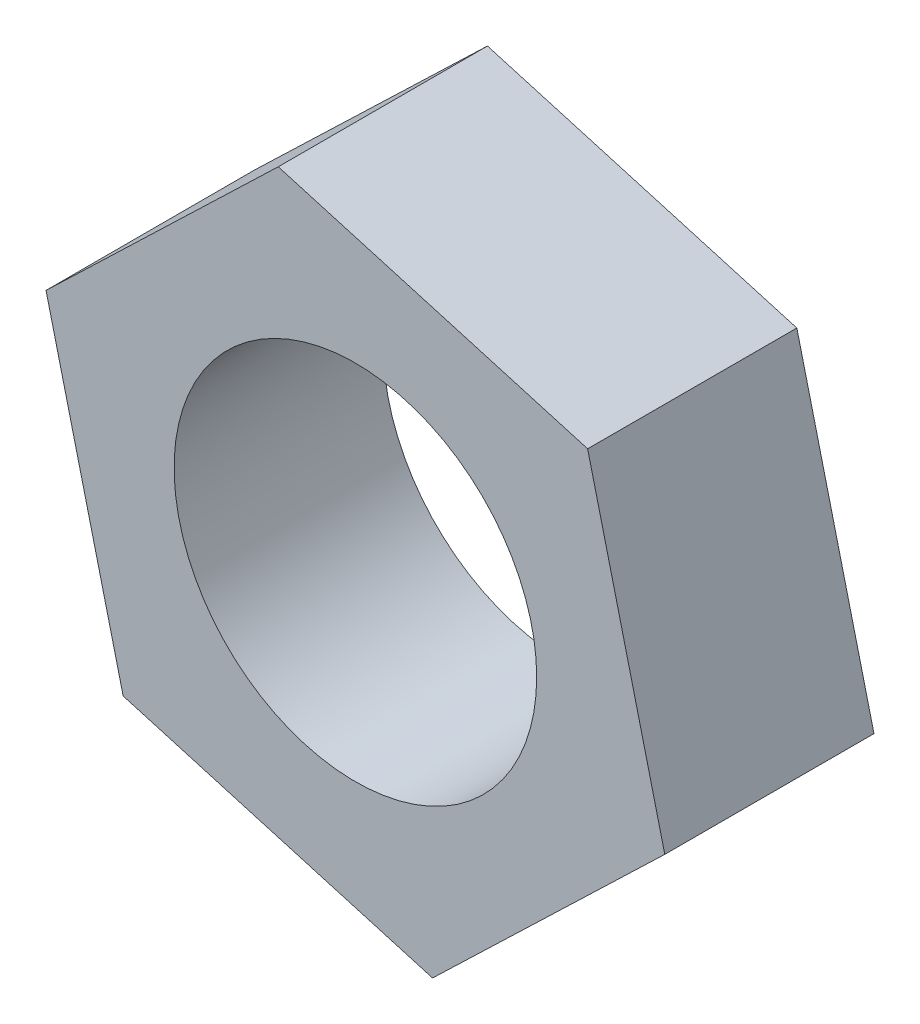
ISO-10303-21;
HEADER;
FILE_DESCRIPTION(('STEP AP214'),'2;1');
FILE_NAME('part.step','',(''),(''),'','','');
FILE_SCHEMA(('AUTOMOTIVE_DESIGN { 1 0 10303 214 1 1 1 1 }'));
ENDSEC;
DATA;
#1=APPLICATION_CONTEXT('core data for automotive mechanical design processes');
#2=APPLICATION_PROTOCOL_DEFINITION('international standard','automotive_design',2000,#1);
#3=PRODUCT_CONTEXT('',#1,'mechanical');
#4=PRODUCT('Part','Part','',(#3));
#5=PRODUCT_RELATED_PRODUCT_CATEGORY('part','',(#4));
#6=PRODUCT_DEFINITION_FORMATION('','',#4);
#7=PRODUCT_DEFINITION_CONTEXT('part definition',#1,'design');
#8=PRODUCT_DEFINITION('design','',#6,#7);
#9=PRODUCT_DEFINITION_SHAPE('','',#8);
#10=(LENGTH_UNIT() NAMED_UNIT(*) SI_UNIT(.MILLI.,.METRE.));
#11=(NAMED_UNIT(*) PLANE_ANGLE_UNIT() SI_UNIT($,.RADIAN.));
#12=(NAMED_UNIT(*) SI_UNIT($,.STERADIAN.) SOLID_ANGLE_UNIT());
#13=UNCERTAINTY_MEASURE_WITH_UNIT(LENGTH_MEASURE(1.E-05),#10,'distance_accuracy_value','');
#14=(GEOMETRIC_REPRESENTATION_CONTEXT(3) GLOBAL_UNCERTAINTY_ASSIGNED_CONTEXT((#13)) GLOBAL_UNIT_ASSIGNED_CONTEXT((#10,
#11,#12)) REPRESENTATION_CONTEXT('',''));
#15=CARTESIAN_POINT('',(0.,0.,0.));
#16=DIRECTION('',(0.,0.,1.));
#17=DIRECTION('',(1.,0.,0.));
#18=AXIS2_PLACEMENT_3D('',#15,#16,#17);
#19=CARTESIAN_POINT('',(0.,0.,3.));
#20=DIRECTION('',(0.,0.,1.));
#21=DIRECTION('',(1.,0.,0.));
#22=AXIS2_PLACEMENT_3D('',#19,#20,#21);
#23=PLANE('',#22);
#24=DIRECTION('',(0.960574467566199,-0.278022826868429,0.));
#25=VECTOR('',#24,1.);
#26=CARTESIAN_POINT('',(-3.33044301717783,-3.20023165453141,3.));
#27=LINE('',#26,#25);
#28=CARTESIAN_POINT('',(-3.33044301717783,-3.20023165453141,3.));
#29=VERTEX_POINT('',#28);
#30=CARTESIAN_POINT('',(1.10626040223039,-4.48436408599819,3.));
#31=VERTEX_POINT('',#30);
#32=EDGE_CURVE('E144',#29,#31,#27,.T.);
#33=ORIENTED_EDGE('',*,*,#32,.T.);
#34=DIRECTION('',(0.721062064683122,0.692870477704826,0.));
#35=VECTOR('',#34,1.);
#36=CARTESIAN_POINT('',(1.10626040223039,-4.48436408599819,3.));
#37=LINE('',#36,#35);
#38=CARTESIAN_POINT('',(4.43670341940821,-1.28413243146678,3.));
#39=VERTEX_POINT('',#38);
#40=EDGE_CURVE('E91',#31,#39,#37,.T.);
#41=ORIENTED_EDGE('',*,*,#40,.T.);
#42=DIRECTION('',(-0.239512402883077,0.970893304573255,0.));
#43=VECTOR('',#42,1.);
#44=CARTESIAN_POINT('',(4.43670341940821,-1.28413243146678,3.));
#45=LINE('',#44,#43);
#46=CARTESIAN_POINT('',(3.33044301717782,3.20023165453141,3.));
#47=VERTEX_POINT('',#46);
#48=EDGE_CURVE('E104',#39,#47,#45,.T.);
#49=ORIENTED_EDGE('',*,*,#48,.T.);
#50=DIRECTION('',(-0.960574467566199,0.278022826868429,0.));
#51=VECTOR('',#50,1.);
#52=CARTESIAN_POINT('',(3.33044301717782,3.20023165453141,3.));
#53=LINE('',#52,#51);
#54=CARTESIAN_POINT('',(-1.10626040223039,4.48436408599819,3.));
#55=VERTEX_POINT('',#54);
#56=EDGE_CURVE('E98',#47,#55,#53,.T.);
#57=ORIENTED_EDGE('',*,*,#56,.T.);
#58=DIRECTION('',(-0.721062064683122,-0.692870477704825,0.));
#59=VECTOR('',#58,1.);
#60=CARTESIAN_POINT('',(-1.10626040223039,4.48436408599819,3.));
#61=LINE('',#60,#59);
#62=CARTESIAN_POINT('',(-4.43670341940822,1.28413243146679,3.));
#63=VERTEX_POINT('',#62);
#64=EDGE_CURVE('E102',#55,#63,#61,.T.);
#65=ORIENTED_EDGE('',*,*,#64,.T.);
#66=DIRECTION('',(0.239512402883077,-0.970893304573255,0.));
#67=VECTOR('',#66,1.);
#68=CARTESIAN_POINT('',(-4.43670341940822,1.28413243146679,3.));
#69=LINE('',#68,#67);
#70=EDGE_CURVE('E54',#63,#29,#69,.T.);
#71=ORIENTED_EDGE('',*,*,#70,.T.);
#72=EDGE_LOOP('',(#33,#41,#49,#57,#65,#71));
#73=FACE_BOUND('',#72,.T.);
#74=CARTESIAN_POINT('',(0.,0.,3.));
#75=DIRECTION('',(0.,0.,1.));
#76=DIRECTION('',(1.,0.,0.));
#77=AXIS2_PLACEMENT_3D('',#74,#75,#76);
#78=CIRCLE('',#77,2.6);
#79=CARTESIAN_POINT('',(2.6,0.,3.));
#80=VERTEX_POINT('',#79);
#81=EDGE_CURVE('E132',#80,#80,#78,.T.);
#82=ORIENTED_EDGE('',*,*,#81,.F.);
#83=EDGE_LOOP('',(#82));
#84=FACE_BOUND('',#83,.T.);
#85=ADVANCED_FACE('F36',(#73,#84),#23,.T.);
#86=CARTESIAN_POINT('',(0.,0.,0.));
#87=DIRECTION('',(0.,0.,1.));
#88=DIRECTION('',(1.,0.,0.));
#89=AXIS2_PLACEMENT_3D('',#86,#87,#88);
#90=PLANE('',#89);
#91=DIRECTION('',(0.960574467566199,-0.278022826868429,0.));
#92=VECTOR('',#91,1.);
#93=CARTESIAN_POINT('',(-3.33044301717783,-3.20023165453141,0.));
#94=LINE('',#93,#92);
#95=CARTESIAN_POINT('',(-3.33044301717783,-3.20023165453141,0.));
#96=VERTEX_POINT('',#95);
#97=CARTESIAN_POINT('',(1.10626040223039,-4.48436408599819,0.));
#98=VERTEX_POINT('',#97);
#99=EDGE_CURVE('E127',#96,#98,#94,.T.);
#100=ORIENTED_EDGE('',*,*,#99,.F.);
#101=DIRECTION('',(0.239512402883077,-0.970893304573255,0.));
#102=VECTOR('',#101,1.);
#103=CARTESIAN_POINT('',(-4.43670341940822,1.28413243146679,0.));
#104=LINE('',#103,#102);
#105=CARTESIAN_POINT('',(-4.43670341940822,1.28413243146679,0.));
#106=VERTEX_POINT('',#105);
#107=EDGE_CURVE('E83',#106,#96,#104,.T.);
#108=ORIENTED_EDGE('',*,*,#107,.F.);
#109=DIRECTION('',(-0.721062064683122,-0.692870477704825,0.));
#110=VECTOR('',#109,1.);
#111=CARTESIAN_POINT('',(-1.10626040223039,4.48436408599819,0.));
#112=LINE('',#111,#110);
#113=CARTESIAN_POINT('',(-1.10626040223039,4.48436408599819,0.));
#114=VERTEX_POINT('',#113);
#115=EDGE_CURVE('E77',#114,#106,#112,.T.);
#116=ORIENTED_EDGE('',*,*,#115,.F.);
#117=DIRECTION('',(-0.960574467566199,0.278022826868429,0.));
#118=VECTOR('',#117,1.);
#119=CARTESIAN_POINT('',(3.33044301717782,3.20023165453141,0.));
#120=LINE('',#119,#118);
#121=CARTESIAN_POINT('',(3.33044301717782,3.20023165453141,0.));
#122=VERTEX_POINT('',#121);
#123=EDGE_CURVE('E113',#122,#114,#120,.T.);
#124=ORIENTED_EDGE('',*,*,#123,.F.);
#125=DIRECTION('',(-0.239512402883077,0.970893304573255,0.));
#126=VECTOR('',#125,1.);
#127=CARTESIAN_POINT('',(4.43670341940821,-1.28413243146678,0.));
#128=LINE('',#127,#126);
#129=CARTESIAN_POINT('',(4.43670341940821,-1.28413243146678,0.));
#130=VERTEX_POINT('',#129);
#131=EDGE_CURVE('E135',#130,#122,#128,.T.);
#132=ORIENTED_EDGE('',*,*,#131,.F.);
#133=DIRECTION('',(0.721062064683122,0.692870477704826,0.));
#134=VECTOR('',#133,1.);
#135=CARTESIAN_POINT('',(1.10626040223039,-4.48436408599819,0.));
#136=LINE('',#135,#134);
#137=EDGE_CURVE('E131',#98,#130,#136,.T.);
#138=ORIENTED_EDGE('',*,*,#137,.F.);
#139=EDGE_LOOP('',(#100,#108,#116,#124,#132,#138));
#140=FACE_BOUND('',#139,.T.);
#141=CARTESIAN_POINT('',(0.,0.,0.));
#142=DIRECTION('',(0.,0.,1.));
#143=DIRECTION('',(1.,0.,0.));
#144=AXIS2_PLACEMENT_3D('',#141,#142,#143);
#145=CIRCLE('',#144,2.6);
#146=CARTESIAN_POINT('',(2.6,0.,0.));
#147=VERTEX_POINT('',#146);
#148=EDGE_CURVE('E249',#147,#147,#145,.T.);
#149=ORIENTED_EDGE('',*,*,#148,.T.);
#150=EDGE_LOOP('',(#149));
#151=FACE_BOUND('',#150,.T.);
#152=ADVANCED_FACE('F156',(#140,#151),#90,.F.);
#153=CARTESIAN_POINT('',(-3.33044301717783,-3.20023165453141,3.));
#154=DIRECTION('',(0.278022826868429,0.960574467566199,0.));
#155=DIRECTION('',(-0.960574467566199,0.278022826868429,0.));
#156=AXIS2_PLACEMENT_3D('',#153,#154,#155);
#157=PLANE('',#156);
#158=ORIENTED_EDGE('',*,*,#99,.T.);
#159=DIRECTION('',(0.,0.,-1.));
#160=VECTOR('',#159,1.);
#161=CARTESIAN_POINT('',(1.10626040223039,-4.48436408599819,3.));
#162=LINE('',#161,#160);
#163=EDGE_CURVE('E11',#31,#98,#162,.T.);
#164=ORIENTED_EDGE('',*,*,#163,.F.);
#165=ORIENTED_EDGE('',*,*,#32,.F.);
#166=DIRECTION('',(0.,0.,-1.));
#167=VECTOR('',#166,1.);
#168=CARTESIAN_POINT('',(-3.33044301717783,-3.20023165453141,3.));
#169=LINE('',#168,#167);
#170=EDGE_CURVE('E123',#29,#96,#169,.T.);
#171=ORIENTED_EDGE('',*,*,#170,.T.);
#172=EDGE_LOOP('',(#158,#164,#165,#171));
#173=FACE_BOUND('',#172,.T.);
#174=ADVANCED_FACE('F38',(#173),#157,.F.);
#175=CARTESIAN_POINT('',(1.10626040223039,-4.48436408599819,3.));
#176=DIRECTION('',(-0.692870477704826,0.721062064683122,0.));
#177=DIRECTION('',(-0.721062064683122,-0.692870477704826,0.));
#178=AXIS2_PLACEMENT_3D('',#175,#176,#177);
#179=PLANE('',#178);
#180=ORIENTED_EDGE('',*,*,#137,.T.);
#181=DIRECTION('',(0.,0.,-1.));
#182=VECTOR('',#181,1.);
#183=CARTESIAN_POINT('',(4.43670341940821,-1.28413243146678,3.));
#184=LINE('',#183,#182);
#185=EDGE_CURVE('E46',#39,#130,#184,.T.);
#186=ORIENTED_EDGE('',*,*,#185,.F.);
#187=ORIENTED_EDGE('',*,*,#40,.F.);
#188=ORIENTED_EDGE('',*,*,#163,.T.);
#189=EDGE_LOOP('',(#180,#186,#187,#188));
#190=FACE_BOUND('',#189,.T.);
#191=ADVANCED_FACE('F181',(#190),#179,.F.);
#192=CARTESIAN_POINT('',(4.43670341940821,-1.28413243146678,3.));
#193=DIRECTION('',(-0.970893304573255,-0.239512402883077,0.));
#194=DIRECTION('',(0.239512402883077,-0.970893304573255,0.));
#195=AXIS2_PLACEMENT_3D('',#192,#193,#194);
#196=PLANE('',#195);
#197=ORIENTED_EDGE('',*,*,#131,.T.);
#198=DIRECTION('',(0.,0.,-1.));
#199=VECTOR('',#198,1.);
#200=CARTESIAN_POINT('',(3.33044301717782,3.20023165453141,3.));
#201=LINE('',#200,#199);
#202=EDGE_CURVE('E115',#47,#122,#201,.T.);
#203=ORIENTED_EDGE('',*,*,#202,.F.);
#204=ORIENTED_EDGE('',*,*,#48,.F.);
#205=ORIENTED_EDGE('',*,*,#185,.T.);
#206=EDGE_LOOP('',(#197,#203,#204,#205));
#207=FACE_BOUND('',#206,.T.);
#208=ADVANCED_FACE('F153',(#207),#196,.F.);
#209=CARTESIAN_POINT('',(3.33044301717782,3.20023165453141,3.));
#210=DIRECTION('',(-0.278022826868429,-0.960574467566199,0.));
#211=DIRECTION('',(0.960574467566199,-0.278022826868429,0.));
#212=AXIS2_PLACEMENT_3D('',#209,#210,#211);
#213=PLANE('',#212);
#214=ORIENTED_EDGE('',*,*,#123,.T.);
#215=DIRECTION('',(0.,0.,-1.));
#216=VECTOR('',#215,1.);
#217=CARTESIAN_POINT('',(-1.10626040223039,4.48436408599819,3.));
#218=LINE('',#217,#216);
#219=EDGE_CURVE('E110',#55,#114,#218,.T.);
#220=ORIENTED_EDGE('',*,*,#219,.F.);
#221=ORIENTED_EDGE('',*,*,#56,.F.);
#222=ORIENTED_EDGE('',*,*,#202,.T.);
#223=EDGE_LOOP('',(#214,#220,#221,#222));
#224=FACE_BOUND('',#223,.T.);
#225=ADVANCED_FACE('F111',(#224),#213,.F.);
#226=CARTESIAN_POINT('',(-1.10626040223039,4.48436408599819,3.));
#227=DIRECTION('',(0.692870477704825,-0.721062064683122,0.));
#228=DIRECTION('',(0.721062064683122,0.692870477704825,0.));
#229=AXIS2_PLACEMENT_3D('',#226,#227,#228);
#230=PLANE('',#229);
#231=ORIENTED_EDGE('',*,*,#115,.T.);
#232=DIRECTION('',(0.,0.,-1.));
#233=VECTOR('',#232,1.);
#234=CARTESIAN_POINT('',(-4.43670341940822,1.28413243146679,3.));
#235=LINE('',#234,#233);
#236=EDGE_CURVE('E116',#63,#106,#235,.T.);
#237=ORIENTED_EDGE('',*,*,#236,.F.);
#238=ORIENTED_EDGE('',*,*,#64,.F.);
#239=ORIENTED_EDGE('',*,*,#219,.T.);
#240=EDGE_LOOP('',(#231,#237,#238,#239));
#241=FACE_BOUND('',#240,.T.);
#242=ADVANCED_FACE('F118',(#241),#230,.F.);
#243=CARTESIAN_POINT('',(-4.43670341940822,1.28413243146679,3.));
#244=DIRECTION('',(0.970893304573255,0.239512402883077,0.));
#245=DIRECTION('',(-0.239512402883077,0.970893304573255,0.));
#246=AXIS2_PLACEMENT_3D('',#243,#244,#245);
#247=PLANE('',#246);
#248=ORIENTED_EDGE('',*,*,#107,.T.);
#249=ORIENTED_EDGE('',*,*,#170,.F.);
#250=ORIENTED_EDGE('',*,*,#70,.F.);
#251=ORIENTED_EDGE('',*,*,#236,.T.);
#252=EDGE_LOOP('',(#248,#249,#250,#251));
#253=FACE_BOUND('',#252,.T.);
#254=ADVANCED_FACE('F161',(#253),#247,.F.);
#255=CARTESIAN_POINT('',(0.,0.,3.));
#256=DIRECTION('',(0.,0.,-1.));
#257=DIRECTION('',(-1.,0.,0.));
#258=AXIS2_PLACEMENT_3D('',#255,#256,#257);
#259=CYLINDRICAL_SURFACE('',#258,2.6);
#260=ORIENTED_EDGE('',*,*,#81,.T.);
#261=EDGE_LOOP('',(#260));
#262=FACE_BOUND('',#261,.T.);
#263=ORIENTED_EDGE('',*,*,#148,.F.);
#264=EDGE_LOOP('',(#263));
#265=FACE_BOUND('',#264,.T.);
#266=ADVANCED_FACE('F163',(#262,#265),#259,.F.);
#267=CLOSED_SHELL('',(#85,#152,#174,#191,#208,#225,#242,#254,#266));
#268=MANIFOLD_SOLID_BREP('B2',#267);
#269=ADVANCED_BREP_SHAPE_REPRESENTATION('',(#18,#268),#14);
#270=SHAPE_DEFINITION_REPRESENTATION(#9,#269);
ENDSEC;
END-ISO-10303-21;
